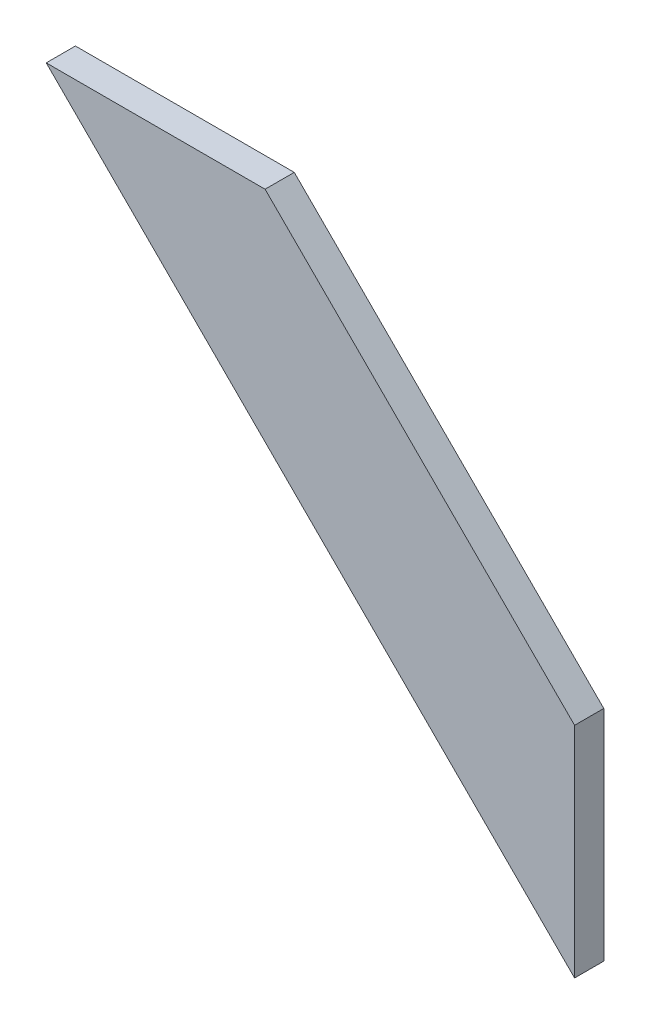
ISO-10303-21;
HEADER;
FILE_DESCRIPTION(('STEP AP214'),'2;1');
FILE_NAME('part.step','',(''),(''),'','','');
FILE_SCHEMA(('AUTOMOTIVE_DESIGN { 1 0 10303 214 1 1 1 1 }'));
ENDSEC;
DATA;
#1=APPLICATION_CONTEXT('core data for automotive mechanical design processes');
#2=APPLICATION_PROTOCOL_DEFINITION('international standard','automotive_design',2000,#1);
#3=PRODUCT_CONTEXT('',#1,'mechanical');
#4=PRODUCT('Part','Part','',(#3));
#5=PRODUCT_RELATED_PRODUCT_CATEGORY('part','',(#4));
#6=PRODUCT_DEFINITION_FORMATION('','',#4);
#7=PRODUCT_DEFINITION_CONTEXT('part definition',#1,'design');
#8=PRODUCT_DEFINITION('design','',#6,#7);
#9=PRODUCT_DEFINITION_SHAPE('','',#8);
#10=(LENGTH_UNIT() NAMED_UNIT(*) SI_UNIT(.MILLI.,.METRE.));
#11=(NAMED_UNIT(*) PLANE_ANGLE_UNIT() SI_UNIT($,.RADIAN.));
#12=(NAMED_UNIT(*) SI_UNIT($,.STERADIAN.) SOLID_ANGLE_UNIT());
#13=UNCERTAINTY_MEASURE_WITH_UNIT(LENGTH_MEASURE(1.E-05),#10,'distance_accuracy_value','');
#14=(GEOMETRIC_REPRESENTATION_CONTEXT(3) GLOBAL_UNCERTAINTY_ASSIGNED_CONTEXT((#13)) GLOBAL_UNIT_ASSIGNED_CONTEXT((#10,
#11,#12)) REPRESENTATION_CONTEXT('',''));
#15=CARTESIAN_POINT('',(0.,0.,0.));
#16=DIRECTION('',(0.,0.,1.));
#17=DIRECTION('',(1.,0.,0.));
#18=AXIS2_PLACEMENT_3D('',#15,#16,#17);
#19=CARTESIAN_POINT('',(36.2132034355963,-36.2132034355965,2.));
#20=DIRECTION('',(0.707106781186549,0.707106781186546,0.));
#21=DIRECTION('',(-0.707106781186546,0.707106781186549,0.));
#22=AXIS2_PLACEMENT_3D('',#19,#20,#21);
#23=PLANE('',#22);
#24=DIRECTION('',(0.707106781186546,-0.707106781186549,0.));
#25=VECTOR('',#24,1.);
#26=CARTESIAN_POINT('',(36.2132034355963,-36.2132034355965,0.));
#27=LINE('',#26,#25);
#28=CARTESIAN_POINT('',(0.,0.,0.));
#29=VERTEX_POINT('',#28);
#30=CARTESIAN_POINT('',(36.2132034355963,-36.2132034355965,0.));
#31=VERTEX_POINT('',#30);
#32=EDGE_CURVE('E107',#29,#31,#27,.T.);
#33=ORIENTED_EDGE('',*,*,#32,.T.);
#34=DIRECTION('',(0.,0.,-1.));
#35=VECTOR('',#34,1.);
#36=CARTESIAN_POINT('',(36.2132034355963,-36.2132034355965,2.));
#37=LINE('',#36,#35);
#38=CARTESIAN_POINT('',(36.2132034355963,-36.2132034355965,2.));
#39=VERTEX_POINT('',#38);
#40=EDGE_CURVE('E11',#39,#31,#37,.T.);
#41=ORIENTED_EDGE('',*,*,#40,.F.);
#42=DIRECTION('',(0.707106781186546,-0.707106781186549,0.));
#43=VECTOR('',#42,1.);
#44=CARTESIAN_POINT('',(36.2132034355963,-36.2132034355965,2.));
#45=LINE('',#44,#43);
#46=CARTESIAN_POINT('',(0.,0.,2.));
#47=VERTEX_POINT('',#46);
#48=EDGE_CURVE('E91',#47,#39,#45,.T.);
#49=ORIENTED_EDGE('',*,*,#48,.F.);
#50=DIRECTION('',(0.,0.,-1.));
#51=VECTOR('',#50,1.);
#52=CARTESIAN_POINT('',(0.,0.,2.));
#53=LINE('',#52,#51);
#54=EDGE_CURVE('E103',#47,#29,#53,.T.);
#55=ORIENTED_EDGE('',*,*,#54,.T.);
#56=EDGE_LOOP('',(#33,#41,#49,#55));
#57=FACE_BOUND('',#56,.T.);
#58=ADVANCED_FACE('F39',(#57),#23,.F.);
#59=CARTESIAN_POINT('',(36.2132034355964,-21.2132034355965,2.));
#60=DIRECTION('',(-1.,0.,0.));
#61=DIRECTION('',(0.,-1.,0.));
#62=AXIS2_PLACEMENT_3D('',#59,#60,#61);
#63=PLANE('',#62);
#64=DIRECTION('',(0.,1.,0.));
#65=VECTOR('',#64,1.);
#66=CARTESIAN_POINT('',(36.2132034355964,-21.2132034355965,0.));
#67=LINE('',#66,#65);
#68=CARTESIAN_POINT('',(36.2132034355964,-21.2132034355965,0.));
#69=VERTEX_POINT('',#68);
#70=EDGE_CURVE('E96',#31,#69,#67,.T.);
#71=ORIENTED_EDGE('',*,*,#70,.T.);
#72=DIRECTION('',(0.,0.,-1.));
#73=VECTOR('',#72,1.);
#74=CARTESIAN_POINT('',(36.2132034355964,-21.2132034355965,2.));
#75=LINE('',#74,#73);
#76=CARTESIAN_POINT('',(36.2132034355964,-21.2132034355965,2.));
#77=VERTEX_POINT('',#76);
#78=EDGE_CURVE('E48',#77,#69,#75,.T.);
#79=ORIENTED_EDGE('',*,*,#78,.F.);
#80=DIRECTION('',(0.,1.,0.));
#81=VECTOR('',#80,1.);
#82=CARTESIAN_POINT('',(36.2132034355964,-21.2132034355965,2.));
#83=LINE('',#82,#81);
#84=EDGE_CURVE('E86',#39,#77,#83,.T.);
#85=ORIENTED_EDGE('',*,*,#84,.F.);
#86=ORIENTED_EDGE('',*,*,#40,.T.);
#87=EDGE_LOOP('',(#71,#79,#85,#86));
#88=FACE_BOUND('',#87,.T.);
#89=ADVANCED_FACE('F95',(#88),#63,.F.);
#90=CARTESIAN_POINT('',(15.,0.,2.));
#91=DIRECTION('',(-0.707106781186549,-0.707106781186546,0.));
#92=DIRECTION('',(0.707106781186546,-0.707106781186549,0.));
#93=AXIS2_PLACEMENT_3D('',#90,#91,#92);
#94=PLANE('',#93);
#95=DIRECTION('',(-0.707106781186546,0.707106781186549,0.));
#96=VECTOR('',#95,1.);
#97=CARTESIAN_POINT('',(15.,0.,0.));
#98=LINE('',#97,#96);
#99=CARTESIAN_POINT('',(15.,0.,0.));
#100=VERTEX_POINT('',#99);
#101=EDGE_CURVE('E73',#69,#100,#98,.T.);
#102=ORIENTED_EDGE('',*,*,#101,.T.);
#103=DIRECTION('',(0.,0.,-1.));
#104=VECTOR('',#103,1.);
#105=CARTESIAN_POINT('',(15.,0.,2.));
#106=LINE('',#105,#104);
#107=CARTESIAN_POINT('',(15.,0.,2.));
#108=VERTEX_POINT('',#107);
#109=EDGE_CURVE('E98',#108,#100,#106,.T.);
#110=ORIENTED_EDGE('',*,*,#109,.F.);
#111=DIRECTION('',(-0.707106781186546,0.707106781186549,0.));
#112=VECTOR('',#111,1.);
#113=CARTESIAN_POINT('',(15.,0.,2.));
#114=LINE('',#113,#112);
#115=EDGE_CURVE('E89',#77,#108,#114,.T.);
#116=ORIENTED_EDGE('',*,*,#115,.F.);
#117=ORIENTED_EDGE('',*,*,#78,.T.);
#118=EDGE_LOOP('',(#102,#110,#116,#117));
#119=FACE_BOUND('',#118,.T.);
#120=ADVANCED_FACE('F99',(#119),#94,.F.);
#121=CARTESIAN_POINT('',(0.,0.,2.));
#122=DIRECTION('',(0.,-1.,0.));
#123=DIRECTION('',(0.,0.,-1.));
#124=AXIS2_PLACEMENT_3D('',#121,#122,#123);
#125=PLANE('',#124);
#126=DIRECTION('',(-1.,0.,0.));
#127=VECTOR('',#126,1.);
#128=CARTESIAN_POINT('',(0.,0.,0.));
#129=LINE('',#128,#127);
#130=EDGE_CURVE('E79',#100,#29,#129,.T.);
#131=ORIENTED_EDGE('',*,*,#130,.T.);
#132=ORIENTED_EDGE('',*,*,#54,.F.);
#133=DIRECTION('',(-1.,0.,0.));
#134=VECTOR('',#133,1.);
#135=CARTESIAN_POINT('',(0.,0.,2.));
#136=LINE('',#135,#134);
#137=EDGE_CURVE('E56',#108,#47,#136,.T.);
#138=ORIENTED_EDGE('',*,*,#137,.F.);
#139=ORIENTED_EDGE('',*,*,#109,.T.);
#140=EDGE_LOOP('',(#131,#132,#138,#139));
#141=FACE_BOUND('',#140,.T.);
#142=ADVANCED_FACE('F120',(#141),#125,.F.);
#143=CARTESIAN_POINT('',(0.,0.,2.));
#144=DIRECTION('',(0.,0.,-1.));
#145=DIRECTION('',(-1.,0.,0.));
#146=AXIS2_PLACEMENT_3D('',#143,#144,#145);
#147=PLANE('',#146);
#148=ORIENTED_EDGE('',*,*,#48,.T.);
#149=ORIENTED_EDGE('',*,*,#84,.T.);
#150=ORIENTED_EDGE('',*,*,#115,.T.);
#151=ORIENTED_EDGE('',*,*,#137,.T.);
#152=EDGE_LOOP('',(#148,#149,#150,#151));
#153=FACE_BOUND('',#152,.T.);
#154=ADVANCED_FACE('F87',(#153),#147,.F.);
#155=CARTESIAN_POINT('',(0.,0.,0.));
#156=DIRECTION('',(0.,0.,-1.));
#157=DIRECTION('',(-1.,0.,0.));
#158=AXIS2_PLACEMENT_3D('',#155,#156,#157);
#159=PLANE('',#158);
#160=ORIENTED_EDGE('',*,*,#32,.F.);
#161=ORIENTED_EDGE('',*,*,#130,.F.);
#162=ORIENTED_EDGE('',*,*,#101,.F.);
#163=ORIENTED_EDGE('',*,*,#70,.F.);
#164=EDGE_LOOP('',(#160,#161,#162,#163));
#165=FACE_BOUND('',#164,.T.);
#166=ADVANCED_FACE('F123',(#165),#159,.T.);
#167=CLOSED_SHELL('',(#58,#89,#120,#142,#154,#166));
#168=MANIFOLD_SOLID_BREP('B2',#167);
#169=ADVANCED_BREP_SHAPE_REPRESENTATION('',(#18,#168),#14);
#170=SHAPE_DEFINITION_REPRESENTATION(#9,#169);
ENDSEC;
END-ISO-10303-21;
